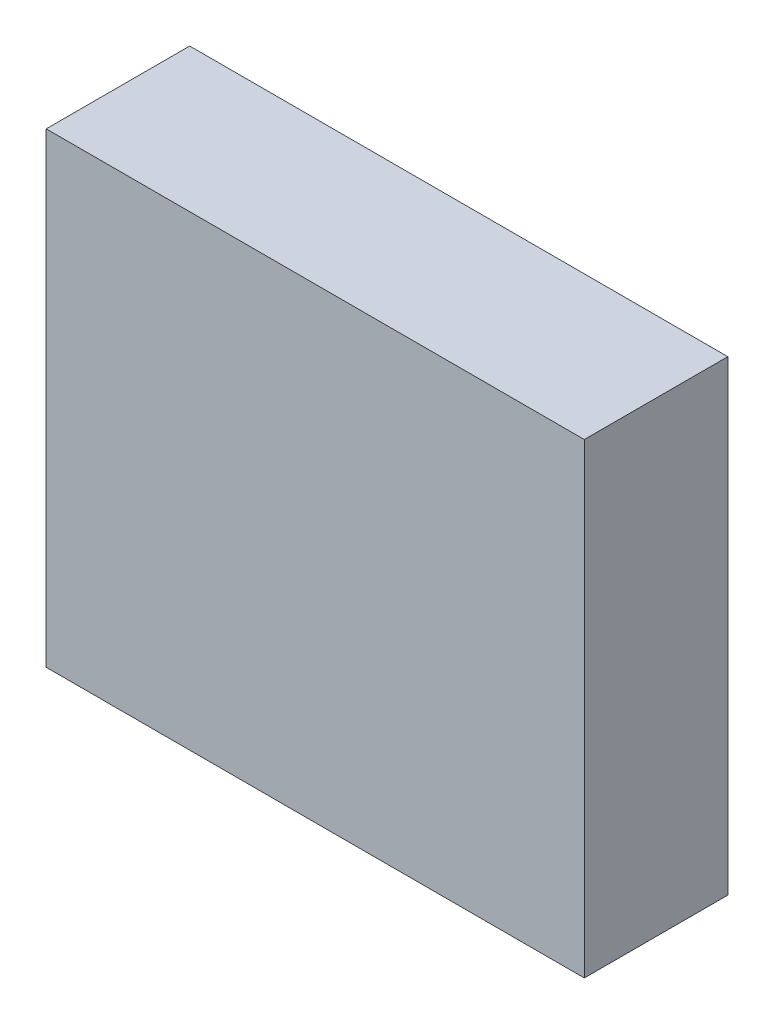
ISO-10303-21;
HEADER;
FILE_DESCRIPTION(('STEP AP214'),'2;1');
FILE_NAME('part.step','',(''),(''),'','','');
FILE_SCHEMA(('AUTOMOTIVE_DESIGN { 1 0 10303 214 1 1 1 1 }'));
ENDSEC;
DATA;
#1=APPLICATION_CONTEXT('core data for automotive mechanical design processes');
#2=APPLICATION_PROTOCOL_DEFINITION('international standard','automotive_design',2000,#1);
#3=PRODUCT_CONTEXT('',#1,'mechanical');
#4=PRODUCT('Part','Part','',(#3));
#5=PRODUCT_RELATED_PRODUCT_CATEGORY('part','',(#4));
#6=PRODUCT_DEFINITION_FORMATION('','',#4);
#7=PRODUCT_DEFINITION_CONTEXT('part definition',#1,'design');
#8=PRODUCT_DEFINITION('design','',#6,#7);
#9=PRODUCT_DEFINITION_SHAPE('','',#8);
#10=(LENGTH_UNIT() NAMED_UNIT(*) SI_UNIT(.MILLI.,.METRE.));
#11=(NAMED_UNIT(*) PLANE_ANGLE_UNIT() SI_UNIT($,.RADIAN.));
#12=(NAMED_UNIT(*) SI_UNIT($,.STERADIAN.) SOLID_ANGLE_UNIT());
#13=UNCERTAINTY_MEASURE_WITH_UNIT(LENGTH_MEASURE(1.E-05),#10,'distance_accuracy_value','');
#14=(GEOMETRIC_REPRESENTATION_CONTEXT(3) GLOBAL_UNCERTAINTY_ASSIGNED_CONTEXT((#13)) GLOBAL_UNIT_ASSIGNED_CONTEXT((#10,
#11,#12)) REPRESENTATION_CONTEXT('',''));
#15=CARTESIAN_POINT('',(0.,0.,0.));
#16=DIRECTION('',(0.,0.,1.));
#17=DIRECTION('',(1.,0.,0.));
#18=AXIS2_PLACEMENT_3D('',#15,#16,#17);
#19=CARTESIAN_POINT('',(-37.5,-32.5,20.));
#20=DIRECTION('',(-1.,0.,0.));
#21=DIRECTION('',(0.,0.,1.));
#22=AXIS2_PLACEMENT_3D('',#19,#20,#21);
#23=PLANE('',#22);
#24=DIRECTION('',(0.,1.,0.));
#25=VECTOR('',#24,1.);
#26=CARTESIAN_POINT('',(-37.5,-32.5,0.));
#27=LINE('',#26,#25);
#28=CARTESIAN_POINT('',(-37.5,-32.5,0.));
#29=VERTEX_POINT('',#28);
#30=CARTESIAN_POINT('',(-37.5,32.5,0.));
#31=VERTEX_POINT('',#30);
#32=EDGE_CURVE('E98',#29,#31,#27,.T.);
#33=ORIENTED_EDGE('',*,*,#32,.F.);
#34=DIRECTION('',(0.,0.,-1.));
#35=VECTOR('',#34,1.);
#36=CARTESIAN_POINT('',(-37.5,-32.5,20.));
#37=LINE('',#36,#35);
#38=CARTESIAN_POINT('',(-37.5,-32.5,20.));
#39=VERTEX_POINT('',#38);
#40=EDGE_CURVE('E11',#39,#29,#37,.T.);
#41=ORIENTED_EDGE('',*,*,#40,.F.);
#42=DIRECTION('',(0.,1.,0.));
#43=VECTOR('',#42,1.);
#44=CARTESIAN_POINT('',(-37.5,-32.5,20.));
#45=LINE('',#44,#43);
#46=CARTESIAN_POINT('',(-37.5,32.5,20.));
#47=VERTEX_POINT('',#46);
#48=EDGE_CURVE('E93',#39,#47,#45,.T.);
#49=ORIENTED_EDGE('',*,*,#48,.T.);
#50=DIRECTION('',(0.,0.,-1.));
#51=VECTOR('',#50,1.);
#52=CARTESIAN_POINT('',(-37.5,32.5,20.));
#53=LINE('',#52,#51);
#54=EDGE_CURVE('E36',#47,#31,#53,.T.);
#55=ORIENTED_EDGE('',*,*,#54,.T.);
#56=EDGE_LOOP('',(#33,#41,#49,#55));
#57=FACE_BOUND('',#56,.T.);
#58=ADVANCED_FACE('F33',(#57),#23,.T.);
#59=CARTESIAN_POINT('',(-37.5,-32.5,20.));
#60=DIRECTION('',(0.,1.,0.));
#61=DIRECTION('',(0.,0.,1.));
#62=AXIS2_PLACEMENT_3D('',#59,#60,#61);
#63=PLANE('',#62);
#64=DIRECTION('',(1.,0.,0.));
#65=VECTOR('',#64,1.);
#66=CARTESIAN_POINT('',(-37.5,-32.5,0.));
#67=LINE('',#66,#65);
#68=CARTESIAN_POINT('',(37.5,-32.5,0.));
#69=VERTEX_POINT('',#68);
#70=EDGE_CURVE('E66',#29,#69,#67,.T.);
#71=ORIENTED_EDGE('',*,*,#70,.T.);
#72=DIRECTION('',(0.,0.,-1.));
#73=VECTOR('',#72,1.);
#74=CARTESIAN_POINT('',(37.5,-32.5,20.));
#75=LINE('',#74,#73);
#76=CARTESIAN_POINT('',(37.5,-32.5,20.));
#77=VERTEX_POINT('',#76);
#78=EDGE_CURVE('E42',#77,#69,#75,.T.);
#79=ORIENTED_EDGE('',*,*,#78,.F.);
#80=DIRECTION('',(1.,0.,0.));
#81=VECTOR('',#80,1.);
#82=CARTESIAN_POINT('',(-37.5,-32.5,20.));
#83=LINE('',#82,#81);
#84=EDGE_CURVE('E83',#39,#77,#83,.T.);
#85=ORIENTED_EDGE('',*,*,#84,.F.);
#86=ORIENTED_EDGE('',*,*,#40,.T.);
#87=EDGE_LOOP('',(#71,#79,#85,#86));
#88=FACE_BOUND('',#87,.T.);
#89=ADVANCED_FACE('F108',(#88),#63,.F.);
#90=CARTESIAN_POINT('',(37.5,-32.5,20.));
#91=DIRECTION('',(-1.,0.,0.));
#92=DIRECTION('',(0.,0.,1.));
#93=AXIS2_PLACEMENT_3D('',#90,#91,#92);
#94=PLANE('',#93);
#95=DIRECTION('',(0.,1.,0.));
#96=VECTOR('',#95,1.);
#97=CARTESIAN_POINT('',(37.5,-32.5,0.));
#98=LINE('',#97,#96);
#99=CARTESIAN_POINT('',(37.5,32.5,0.));
#100=VERTEX_POINT('',#99);
#101=EDGE_CURVE('E90',#69,#100,#98,.T.);
#102=ORIENTED_EDGE('',*,*,#101,.T.);
#103=DIRECTION('',(0.,0.,-1.));
#104=VECTOR('',#103,1.);
#105=CARTESIAN_POINT('',(37.5,32.5,20.));
#106=LINE('',#105,#104);
#107=CARTESIAN_POINT('',(37.5,32.5,20.));
#108=VERTEX_POINT('',#107);
#109=EDGE_CURVE('E87',#108,#100,#106,.T.);
#110=ORIENTED_EDGE('',*,*,#109,.F.);
#111=DIRECTION('',(0.,1.,0.));
#112=VECTOR('',#111,1.);
#113=CARTESIAN_POINT('',(37.5,-32.5,20.));
#114=LINE('',#113,#112);
#115=EDGE_CURVE('E78',#77,#108,#114,.T.);
#116=ORIENTED_EDGE('',*,*,#115,.F.);
#117=ORIENTED_EDGE('',*,*,#78,.T.);
#118=EDGE_LOOP('',(#102,#110,#116,#117));
#119=FACE_BOUND('',#118,.T.);
#120=ADVANCED_FACE('F88',(#119),#94,.F.);
#121=CARTESIAN_POINT('',(-37.5,32.5,20.));
#122=DIRECTION('',(0.,1.,0.));
#123=DIRECTION('',(0.,0.,1.));
#124=AXIS2_PLACEMENT_3D('',#121,#122,#123);
#125=PLANE('',#124);
#126=DIRECTION('',(1.,0.,0.));
#127=VECTOR('',#126,1.);
#128=CARTESIAN_POINT('',(-37.5,32.5,0.));
#129=LINE('',#128,#127);
#130=EDGE_CURVE('E101',#31,#100,#129,.T.);
#131=ORIENTED_EDGE('',*,*,#130,.F.);
#132=ORIENTED_EDGE('',*,*,#54,.F.);
#133=DIRECTION('',(1.,0.,0.));
#134=VECTOR('',#133,1.);
#135=CARTESIAN_POINT('',(-37.5,32.5,20.));
#136=LINE('',#135,#134);
#137=EDGE_CURVE('E82',#47,#108,#136,.T.);
#138=ORIENTED_EDGE('',*,*,#137,.T.);
#139=ORIENTED_EDGE('',*,*,#109,.T.);
#140=EDGE_LOOP('',(#131,#132,#138,#139));
#141=FACE_BOUND('',#140,.T.);
#142=ADVANCED_FACE('F92',(#141),#125,.T.);
#143=CARTESIAN_POINT('',(0.,0.,20.));
#144=DIRECTION('',(0.,0.,-1.));
#145=DIRECTION('',(-1.,0.,0.));
#146=AXIS2_PLACEMENT_3D('',#143,#144,#145);
#147=PLANE('',#146);
#148=ORIENTED_EDGE('',*,*,#48,.F.);
#149=ORIENTED_EDGE('',*,*,#84,.T.);
#150=ORIENTED_EDGE('',*,*,#115,.T.);
#151=ORIENTED_EDGE('',*,*,#137,.F.);
#152=EDGE_LOOP('',(#148,#149,#150,#151));
#153=FACE_BOUND('',#152,.T.);
#154=ADVANCED_FACE('F81',(#153),#147,.F.);
#155=CARTESIAN_POINT('',(0.,0.,0.));
#156=DIRECTION('',(0.,0.,-1.));
#157=DIRECTION('',(-1.,0.,0.));
#158=AXIS2_PLACEMENT_3D('',#155,#156,#157);
#159=PLANE('',#158);
#160=ORIENTED_EDGE('',*,*,#32,.T.);
#161=ORIENTED_EDGE('',*,*,#130,.T.);
#162=ORIENTED_EDGE('',*,*,#101,.F.);
#163=ORIENTED_EDGE('',*,*,#70,.F.);
#164=EDGE_LOOP('',(#160,#161,#162,#163));
#165=FACE_BOUND('',#164,.T.);
#166=ADVANCED_FACE('F106',(#165),#159,.T.);
#167=CLOSED_SHELL('',(#58,#89,#120,#142,#154,#166));
#168=MANIFOLD_SOLID_BREP('B2',#167);
#169=ADVANCED_BREP_SHAPE_REPRESENTATION('',(#18,#168),#14);
#170=SHAPE_DEFINITION_REPRESENTATION(#9,#169);
ENDSEC;
END-ISO-10303-21;
